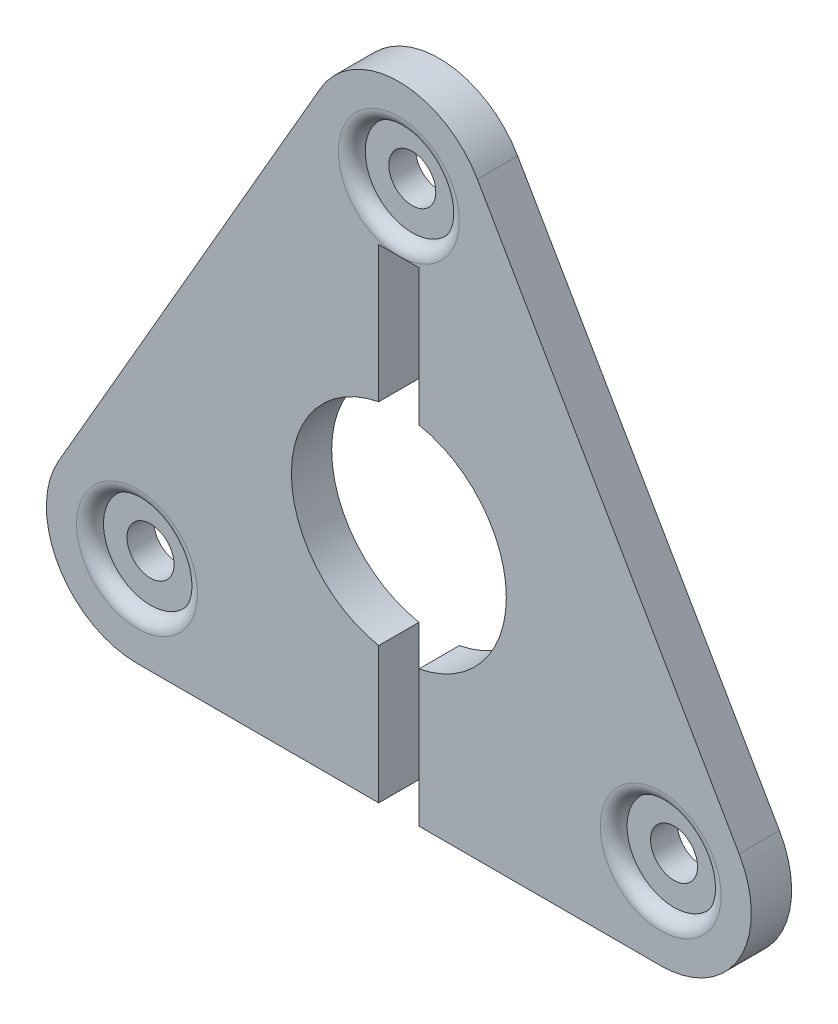
ISO-10303-21;
HEADER;
FILE_DESCRIPTION(('STEP AP214'),'2;1');
FILE_NAME('part.step','',(''),(''),'','','');
FILE_SCHEMA(('AUTOMOTIVE_DESIGN { 1 0 10303 214 1 1 1 1 }'));
ENDSEC;
DATA;
#1=APPLICATION_CONTEXT('core data for automotive mechanical design processes');
#2=APPLICATION_PROTOCOL_DEFINITION('international standard','automotive_design',2000,#1);
#3=PRODUCT_CONTEXT('',#1,'mechanical');
#4=PRODUCT('Part','Part','',(#3));
#5=PRODUCT_RELATED_PRODUCT_CATEGORY('part','',(#4));
#6=PRODUCT_DEFINITION_FORMATION('','',#4);
#7=PRODUCT_DEFINITION_CONTEXT('part definition',#1,'design');
#8=PRODUCT_DEFINITION('design','',#6,#7);
#9=PRODUCT_DEFINITION_SHAPE('','',#8);
#10=(LENGTH_UNIT() NAMED_UNIT(*) SI_UNIT(.MILLI.,.METRE.));
#11=(NAMED_UNIT(*) PLANE_ANGLE_UNIT() SI_UNIT($,.RADIAN.));
#12=(NAMED_UNIT(*) SI_UNIT($,.STERADIAN.) SOLID_ANGLE_UNIT());
#13=UNCERTAINTY_MEASURE_WITH_UNIT(LENGTH_MEASURE(1.E-05),#10,'distance_accuracy_value','');
#14=(GEOMETRIC_REPRESENTATION_CONTEXT(3) GLOBAL_UNCERTAINTY_ASSIGNED_CONTEXT((#13)) GLOBAL_UNIT_ASSIGNED_CONTEXT((#10,
#11,#12)) REPRESENTATION_CONTEXT('',''));
#15=CARTESIAN_POINT('',(0.,0.,0.));
#16=DIRECTION('',(0.,0.,1.));
#17=DIRECTION('',(1.,0.,0.));
#18=AXIS2_PLACEMENT_3D('',#15,#16,#17);
#19=CARTESIAN_POINT('',(19.48557158515,-11.25,3.));
#20=DIRECTION('',(0.,0.,-1.));
#21=DIRECTION('',(-1.,0.,0.));
#22=AXIS2_PLACEMENT_3D('',#19,#20,#21);
#23=CYLINDRICAL_SURFACE('',#22,1.75);
#24=CARTESIAN_POINT('',(19.48557158515,-11.25,0.));
#25=DIRECTION('',(0.,0.,1.));
#26=DIRECTION('',(1.,0.,0.));
#27=AXIS2_PLACEMENT_3D('',#24,#25,#26);
#28=CIRCLE('',#27,1.75);
#29=CARTESIAN_POINT('',(21.23557158515,-11.25,0.));
#30=VERTEX_POINT('',#29);
#31=EDGE_CURVE('E427',#30,#30,#28,.T.);
#32=ORIENTED_EDGE('',*,*,#31,.F.);
#33=EDGE_LOOP('',(#32));
#34=FACE_BOUND('',#33,.T.);
#35=CARTESIAN_POINT('',(19.48557158515,-11.25,2.));
#36=DIRECTION('',(0.,0.,1.));
#37=DIRECTION('',(1.,0.,0.));
#38=AXIS2_PLACEMENT_3D('',#35,#36,#37);
#39=CIRCLE('',#38,1.75);
#40=CARTESIAN_POINT('',(21.23557158515,-11.25,2.));
#41=VERTEX_POINT('',#40);
#42=EDGE_CURVE('E302',#41,#41,#39,.T.);
#43=ORIENTED_EDGE('',*,*,#42,.T.);
#44=EDGE_LOOP('',(#43));
#45=FACE_BOUND('',#44,.T.);
#46=ADVANCED_FACE('F100',(#34,#45),#23,.F.);
#47=CARTESIAN_POINT('',(0.,22.5,3.));
#48=DIRECTION('',(0.,0.,-1.));
#49=DIRECTION('',(-1.,0.,0.));
#50=AXIS2_PLACEMENT_3D('',#47,#48,#49);
#51=CYLINDRICAL_SURFACE('',#50,1.75);
#52=CARTESIAN_POINT('',(0.,22.5,0.));
#53=DIRECTION('',(0.,0.,1.));
#54=DIRECTION('',(1.,0.,0.));
#55=AXIS2_PLACEMENT_3D('',#52,#53,#54);
#56=CIRCLE('',#55,1.75);
#57=CARTESIAN_POINT('',(1.75,22.5,0.));
#58=VERTEX_POINT('',#57);
#59=EDGE_CURVE('E424',#58,#58,#56,.T.);
#60=ORIENTED_EDGE('',*,*,#59,.F.);
#61=EDGE_LOOP('',(#60));
#62=FACE_BOUND('',#61,.T.);
#63=CARTESIAN_POINT('',(0.,22.5,2.));
#64=DIRECTION('',(0.,0.,1.));
#65=DIRECTION('',(1.,0.,0.));
#66=AXIS2_PLACEMENT_3D('',#63,#64,#65);
#67=CIRCLE('',#66,1.75);
#68=CARTESIAN_POINT('',(1.75,22.5,2.));
#69=VERTEX_POINT('',#68);
#70=EDGE_CURVE('E295',#69,#69,#67,.T.);
#71=ORIENTED_EDGE('',*,*,#70,.T.);
#72=EDGE_LOOP('',(#71));
#73=FACE_BOUND('',#72,.T.);
#74=ADVANCED_FACE('F341',(#62,#73),#51,.F.);
#75=CARTESIAN_POINT('',(-19.48557158515,-11.25,3.));
#76=DIRECTION('',(0.,0.,-1.));
#77=DIRECTION('',(-1.,0.,0.));
#78=AXIS2_PLACEMENT_3D('',#75,#76,#77);
#79=CYLINDRICAL_SURFACE('',#78,1.75);
#80=CARTESIAN_POINT('',(-19.48557158515,-11.25,0.));
#81=DIRECTION('',(0.,0.,1.));
#82=DIRECTION('',(1.,0.,0.));
#83=AXIS2_PLACEMENT_3D('',#80,#81,#82);
#84=CIRCLE('',#83,1.75);
#85=CARTESIAN_POINT('',(-17.73557158515,-11.25,0.));
#86=VERTEX_POINT('',#85);
#87=EDGE_CURVE('E277',#86,#86,#84,.T.);
#88=ORIENTED_EDGE('',*,*,#87,.F.);
#89=EDGE_LOOP('',(#88));
#90=FACE_BOUND('',#89,.T.);
#91=CARTESIAN_POINT('',(-19.48557158515,-11.25,2.));
#92=DIRECTION('',(0.,0.,1.));
#93=DIRECTION('',(1.,0.,0.));
#94=AXIS2_PLACEMENT_3D('',#91,#92,#93);
#95=CIRCLE('',#94,1.75);
#96=CARTESIAN_POINT('',(-17.73557158515,-11.25,2.));
#97=VERTEX_POINT('',#96);
#98=EDGE_CURVE('E289',#97,#97,#95,.T.);
#99=ORIENTED_EDGE('',*,*,#98,.T.);
#100=EDGE_LOOP('',(#99));
#101=FACE_BOUND('',#100,.T.);
#102=ADVANCED_FACE('F347',(#90,#101),#79,.F.);
#103=CARTESIAN_POINT('',(0.,0.,3.));
#104=DIRECTION('',(0.,0.,-1.));
#105=DIRECTION('',(-1.,0.,0.));
#106=AXIS2_PLACEMENT_3D('',#103,#104,#105);
#107=CYLINDRICAL_SURFACE('',#106,8.);
#108=CARTESIAN_POINT('',(0.,0.,0.));
#109=DIRECTION('',(0.,0.,1.));
#110=DIRECTION('',(1.,0.,0.));
#111=AXIS2_PLACEMENT_3D('',#108,#109,#110);
#112=CIRCLE('',#111,8.);
#113=CARTESIAN_POINT('',(-1.50000000000001,7.85811682275086,0.));
#114=VERTEX_POINT('',#113);
#115=CARTESIAN_POINT('',(-1.5,-7.85811682275085,0.));
#116=VERTEX_POINT('',#115);
#117=EDGE_CURVE('E310',#114,#116,#112,.T.);
#118=ORIENTED_EDGE('',*,*,#117,.F.);
#119=DIRECTION('',(0.,0.,-1.));
#120=VECTOR('',#119,1.);
#121=CARTESIAN_POINT('',(-1.50000000000001,7.85811682275086,3.));
#122=LINE('',#121,#120);
#123=CARTESIAN_POINT('',(-1.50000000000001,7.85811682275086,3.));
#124=VERTEX_POINT('',#123);
#125=EDGE_CURVE('E178',#124,#114,#122,.T.);
#126=ORIENTED_EDGE('',*,*,#125,.F.);
#127=CARTESIAN_POINT('',(0.,0.,3.));
#128=DIRECTION('',(0.,0.,1.));
#129=DIRECTION('',(1.,0.,0.));
#130=AXIS2_PLACEMENT_3D('',#127,#128,#129);
#131=CIRCLE('',#130,8.);
#132=CARTESIAN_POINT('',(-1.5,-7.85811682275085,3.));
#133=VERTEX_POINT('',#132);
#134=EDGE_CURVE('E264',#124,#133,#131,.T.);
#135=ORIENTED_EDGE('',*,*,#134,.T.);
#136=DIRECTION('',(0.,0.,-1.));
#137=VECTOR('',#136,1.);
#138=CARTESIAN_POINT('',(-1.5,-7.85811682275085,3.));
#139=LINE('',#138,#137);
#140=EDGE_CURVE('E173',#133,#116,#139,.T.);
#141=ORIENTED_EDGE('',*,*,#140,.T.);
#142=EDGE_LOOP('',(#118,#126,#135,#141));
#143=FACE_BOUND('',#142,.T.);
#144=ADVANCED_FACE('F388',(#143),#107,.F.);
#145=CARTESIAN_POINT('',(-1.50000000000001,0.,3.));
#146=DIRECTION('',(1.,0.,0.));
#147=DIRECTION('',(0.,0.,-1.));
#148=AXIS2_PLACEMENT_3D('',#145,#146,#147);
#149=PLANE('',#148);
#150=DIRECTION('',(0.,-1.,0.));
#151=VECTOR('',#150,1.);
#152=CARTESIAN_POINT('',(-1.50000000000001,0.,0.));
#153=LINE('',#152,#151);
#154=CARTESIAN_POINT('',(-1.50000000000001,18.,0.));
#155=VERTEX_POINT('',#154);
#156=EDGE_CURVE('E476',#155,#114,#153,.T.);
#157=ORIENTED_EDGE('',*,*,#156,.F.);
#158=DIRECTION('',(0.,0.,-1.));
#159=VECTOR('',#158,1.);
#160=CARTESIAN_POINT('',(-1.50000000000001,18.,3.));
#161=LINE('',#160,#159);
#162=CARTESIAN_POINT('',(-1.50000000000001,18.,3.));
#163=VERTEX_POINT('',#162);
#164=EDGE_CURVE('E468',#163,#155,#161,.T.);
#165=ORIENTED_EDGE('',*,*,#164,.F.);
#166=DIRECTION('',(0.,-1.,0.));
#167=VECTOR('',#166,1.);
#168=CARTESIAN_POINT('',(-1.50000000000001,0.,3.));
#169=LINE('',#168,#167);
#170=EDGE_CURVE('E272',#163,#124,#169,.T.);
#171=ORIENTED_EDGE('',*,*,#170,.T.);
#172=ORIENTED_EDGE('',*,*,#125,.T.);
#173=EDGE_LOOP('',(#157,#165,#171,#172));
#174=FACE_BOUND('',#173,.T.);
#175=ADVANCED_FACE('F395',(#174),#149,.T.);
#176=CARTESIAN_POINT('',(0.,18.,3.));
#177=DIRECTION('',(0.,1.,0.));
#178=DIRECTION('',(0.,0.,1.));
#179=AXIS2_PLACEMENT_3D('',#176,#177,#178);
#180=PLANE('',#179);
#181=DIRECTION('',(1.,0.,0.));
#182=VECTOR('',#181,1.);
#183=CARTESIAN_POINT('',(0.,18.,0.));
#184=LINE('',#183,#182);
#185=CARTESIAN_POINT('',(1.50000000000001,18.,0.));
#186=VERTEX_POINT('',#185);
#187=EDGE_CURVE('E482',#155,#186,#184,.T.);
#188=ORIENTED_EDGE('',*,*,#187,.T.);
#189=DIRECTION('',(0.,0.,-1.));
#190=VECTOR('',#189,1.);
#191=CARTESIAN_POINT('',(1.50000000000001,18.,3.));
#192=LINE('',#191,#190);
#193=CARTESIAN_POINT('',(1.50000000000001,18.,3.));
#194=VERTEX_POINT('',#193);
#195=EDGE_CURVE('E465',#194,#186,#192,.T.);
#196=ORIENTED_EDGE('',*,*,#195,.F.);
#197=DIRECTION('',(1.,0.,0.));
#198=VECTOR('',#197,1.);
#199=CARTESIAN_POINT('',(0.,18.,3.));
#200=LINE('',#199,#198);
#201=CARTESIAN_POINT('',(0.,18.,3.));
#202=VERTEX_POINT('',#201);
#203=EDGE_CURVE('E271',#202,#194,#200,.T.);
#204=ORIENTED_EDGE('',*,*,#203,.F.);
#205=EDGE_CURVE('E268',#163,#202,#200,.T.);
#206=ORIENTED_EDGE('',*,*,#205,.F.);
#207=ORIENTED_EDGE('',*,*,#164,.T.);
#208=EDGE_LOOP('',(#188,#196,#204,#206,#207));
#209=FACE_BOUND('',#208,.T.);
#210=ADVANCED_FACE('F391',(#209),#180,.F.);
#211=CARTESIAN_POINT('',(1.50000000000001,0.,3.));
#212=DIRECTION('',(1.,0.,0.));
#213=DIRECTION('',(0.,0.,-1.));
#214=AXIS2_PLACEMENT_3D('',#211,#212,#213);
#215=PLANE('',#214);
#216=DIRECTION('',(0.,-1.,0.));
#217=VECTOR('',#216,1.);
#218=CARTESIAN_POINT('',(1.50000000000001,0.,0.));
#219=LINE('',#218,#217);
#220=CARTESIAN_POINT('',(1.5,7.85811682275086,0.));
#221=VERTEX_POINT('',#220);
#222=EDGE_CURVE('E487',#186,#221,#219,.T.);
#223=ORIENTED_EDGE('',*,*,#222,.T.);
#224=DIRECTION('',(0.,0.,-1.));
#225=VECTOR('',#224,1.);
#226=CARTESIAN_POINT('',(1.5,7.85811682275086,3.));
#227=LINE('',#226,#225);
#228=CARTESIAN_POINT('',(1.5,7.85811682275086,3.));
#229=VERTEX_POINT('',#228);
#230=EDGE_CURVE('E462',#229,#221,#227,.T.);
#231=ORIENTED_EDGE('',*,*,#230,.F.);
#232=DIRECTION('',(0.,-1.,0.));
#233=VECTOR('',#232,1.);
#234=CARTESIAN_POINT('',(1.50000000000001,0.,3.));
#235=LINE('',#234,#233);
#236=EDGE_CURVE('E262',#194,#229,#235,.T.);
#237=ORIENTED_EDGE('',*,*,#236,.F.);
#238=ORIENTED_EDGE('',*,*,#195,.T.);
#239=EDGE_LOOP('',(#223,#231,#237,#238));
#240=FACE_BOUND('',#239,.T.);
#241=ADVANCED_FACE('F386',(#240),#215,.F.);
#242=CARTESIAN_POINT('',(1.50000000000001,-7.85811682275086,0.));
#243=VERTEX_POINT('',#242);
#244=EDGE_CURVE('E480',#243,#221,#112,.T.);
#245=ORIENTED_EDGE('',*,*,#244,.F.);
#246=DIRECTION('',(0.,0.,-1.));
#247=VECTOR('',#246,1.);
#248=CARTESIAN_POINT('',(1.50000000000001,-7.85811682275086,3.));
#249=LINE('',#248,#247);
#250=CARTESIAN_POINT('',(1.50000000000001,-7.85811682275086,3.));
#251=VERTEX_POINT('',#250);
#252=EDGE_CURVE('E459',#251,#243,#249,.T.);
#253=ORIENTED_EDGE('',*,*,#252,.F.);
#254=EDGE_CURVE('E256',#251,#229,#131,.T.);
#255=ORIENTED_EDGE('',*,*,#254,.T.);
#256=ORIENTED_EDGE('',*,*,#230,.T.);
#257=EDGE_LOOP('',(#245,#253,#255,#256));
#258=FACE_BOUND('',#257,.T.);
#259=ADVANCED_FACE('F383',(#258),#107,.F.);
#260=CARTESIAN_POINT('',(1.50000000000001,0.,3.));
#261=DIRECTION('',(-1.,0.,0.));
#262=DIRECTION('',(0.,-1.,0.));
#263=AXIS2_PLACEMENT_3D('',#260,#261,#262);
#264=PLANE('',#263);
#265=DIRECTION('',(0.,1.,0.));
#266=VECTOR('',#265,1.);
#267=CARTESIAN_POINT('',(1.50000000000001,0.,0.));
#268=LINE('',#267,#266);
#269=CARTESIAN_POINT('',(1.5,-18.,0.));
#270=VERTEX_POINT('',#269);
#271=EDGE_CURVE('E493',#270,#243,#268,.T.);
#272=ORIENTED_EDGE('',*,*,#271,.F.);
#273=DIRECTION('',(0.,0.,-1.));
#274=VECTOR('',#273,1.);
#275=CARTESIAN_POINT('',(1.5,-18.,3.));
#276=LINE('',#275,#274);
#277=CARTESIAN_POINT('',(1.5,-18.,3.));
#278=VERTEX_POINT('',#277);
#279=EDGE_CURVE('E456',#278,#270,#276,.T.);
#280=ORIENTED_EDGE('',*,*,#279,.F.);
#281=DIRECTION('',(0.,1.,0.));
#282=VECTOR('',#281,1.);
#283=CARTESIAN_POINT('',(1.50000000000001,0.,3.));
#284=LINE('',#283,#282);
#285=EDGE_CURVE('E247',#278,#251,#284,.T.);
#286=ORIENTED_EDGE('',*,*,#285,.T.);
#287=ORIENTED_EDGE('',*,*,#252,.T.);
#288=EDGE_LOOP('',(#272,#280,#286,#287));
#289=FACE_BOUND('',#288,.T.);
#290=ADVANCED_FACE('F380',(#289),#264,.T.);
#291=CARTESIAN_POINT('',(0.,-18.,3.));
#292=DIRECTION('',(0.,-1.,0.));
#293=DIRECTION('',(1.,0.,0.));
#294=AXIS2_PLACEMENT_3D('',#291,#292,#293);
#295=PLANE('',#294);
#296=DIRECTION('',(-1.,0.,0.));
#297=VECTOR('',#296,1.);
#298=CARTESIAN_POINT('',(0.,-18.,0.));
#299=LINE('',#298,#297);
#300=CARTESIAN_POINT('',(19.48557158515,-18.,0.));
#301=VERTEX_POINT('',#300);
#302=EDGE_CURVE('E497',#301,#270,#299,.T.);
#303=ORIENTED_EDGE('',*,*,#302,.F.);
#304=DIRECTION('',(0.,0.,-1.));
#305=VECTOR('',#304,1.);
#306=CARTESIAN_POINT('',(19.48557158515,-18.,3.));
#307=LINE('',#306,#305);
#308=CARTESIAN_POINT('',(19.48557158515,-18.,3.));
#309=VERTEX_POINT('',#308);
#310=EDGE_CURVE('E453',#309,#301,#307,.T.);
#311=ORIENTED_EDGE('',*,*,#310,.F.);
#312=DIRECTION('',(-1.,0.,0.));
#313=VECTOR('',#312,1.);
#314=CARTESIAN_POINT('',(0.,-18.,3.));
#315=LINE('',#314,#313);
#316=EDGE_CURVE('E238',#309,#278,#315,.T.);
#317=ORIENTED_EDGE('',*,*,#316,.T.);
#318=ORIENTED_EDGE('',*,*,#279,.T.);
#319=EDGE_LOOP('',(#303,#311,#317,#318));
#320=FACE_BOUND('',#319,.T.);
#321=ADVANCED_FACE('F361',(#320),#295,.T.);
#322=CARTESIAN_POINT('',(19.48557158515,-11.25,3.));
#323=DIRECTION('',(0.,0.,-1.));
#324=DIRECTION('',(-1.,0.,0.));
#325=AXIS2_PLACEMENT_3D('',#322,#323,#324);
#326=CYLINDRICAL_SURFACE('',#325,6.75);
#327=CARTESIAN_POINT('',(19.48557158515,-11.25,0.));
#328=DIRECTION('',(0.,0.,1.));
#329=DIRECTION('',(1.,0.,0.));
#330=AXIS2_PLACEMENT_3D('',#327,#328,#329);
#331=CIRCLE('',#330,6.75);
#332=CARTESIAN_POINT('',(25.3312430606949,-7.87499999999995,0.));
#333=VERTEX_POINT('',#332);
#334=EDGE_CURVE('E501',#333,#301,#331,.F.);
#335=ORIENTED_EDGE('',*,*,#334,.F.);
#336=DIRECTION('',(0.,0.,-1.));
#337=VECTOR('',#336,1.);
#338=CARTESIAN_POINT('',(25.3312430606949,-7.87499999999995,3.));
#339=LINE('',#338,#337);
#340=CARTESIAN_POINT('',(25.3312430606949,-7.87499999999995,3.));
#341=VERTEX_POINT('',#340);
#342=EDGE_CURVE('E450',#341,#333,#339,.T.);
#343=ORIENTED_EDGE('',*,*,#342,.F.);
#344=CARTESIAN_POINT('',(19.48557158515,-11.25,3.));
#345=DIRECTION('',(0.,0.,1.));
#346=DIRECTION('',(1.,0.,0.));
#347=AXIS2_PLACEMENT_3D('',#344,#345,#346);
#348=CIRCLE('',#347,6.75);
#349=EDGE_CURVE('E246',#341,#309,#348,.F.);
#350=ORIENTED_EDGE('',*,*,#349,.T.);
#351=ORIENTED_EDGE('',*,*,#310,.T.);
#352=EDGE_LOOP('',(#335,#343,#350,#351));
#353=FACE_BOUND('',#352,.T.);
#354=ADVANCED_FACE('F375',(#353),#326,.T.);
#355=CARTESIAN_POINT('',(15.58845726812,9.00000000000004,3.));
#356=DIRECTION('',(0.86602540378444,0.500000000000002,0.));
#357=DIRECTION('',(-0.500000000000003,0.866025403784439,0.));
#358=AXIS2_PLACEMENT_3D('',#355,#356,#357);
#359=PLANE('',#358);
#360=DIRECTION('',(0.500000000000003,-0.866025403784438,0.));
#361=VECTOR('',#360,1.);
#362=CARTESIAN_POINT('',(15.58845726812,9.00000000000004,0.));
#363=LINE('',#362,#361);
#364=CARTESIAN_POINT('',(5.84567147554496,25.875,0.));
#365=VERTEX_POINT('',#364);
#366=EDGE_CURVE('E506',#365,#333,#363,.T.);
#367=ORIENTED_EDGE('',*,*,#366,.F.);
#368=DIRECTION('',(0.,0.,-1.));
#369=VECTOR('',#368,1.);
#370=CARTESIAN_POINT('',(5.84567147554496,25.875,3.));
#371=LINE('',#370,#369);
#372=CARTESIAN_POINT('',(5.84567147554496,25.875,3.));
#373=VERTEX_POINT('',#372);
#374=EDGE_CURVE('E447',#373,#365,#371,.T.);
#375=ORIENTED_EDGE('',*,*,#374,.F.);
#376=DIRECTION('',(0.500000000000003,-0.866025403784438,0.));
#377=VECTOR('',#376,1.);
#378=CARTESIAN_POINT('',(15.58845726812,9.00000000000004,3.));
#379=LINE('',#378,#377);
#380=EDGE_CURVE('E254',#373,#341,#379,.T.);
#381=ORIENTED_EDGE('',*,*,#380,.T.);
#382=ORIENTED_EDGE('',*,*,#342,.T.);
#383=EDGE_LOOP('',(#367,#375,#381,#382));
#384=FACE_BOUND('',#383,.T.);
#385=ADVANCED_FACE('F371',(#384),#359,.T.);
#386=CARTESIAN_POINT('',(0.,22.5,3.));
#387=DIRECTION('',(0.,0.,-1.));
#388=DIRECTION('',(-1.,0.,0.));
#389=AXIS2_PLACEMENT_3D('',#386,#387,#388);
#390=CYLINDRICAL_SURFACE('',#389,6.75);
#391=CARTESIAN_POINT('',(0.,22.5,0.));
#392=DIRECTION('',(0.,0.,1.));
#393=DIRECTION('',(1.,0.,0.));
#394=AXIS2_PLACEMENT_3D('',#391,#392,#393);
#395=CIRCLE('',#394,6.75);
#396=CARTESIAN_POINT('',(-5.84567147554498,25.875,0.));
#397=VERTEX_POINT('',#396);
#398=EDGE_CURVE('E510',#397,#365,#395,.F.);
#399=ORIENTED_EDGE('',*,*,#398,.F.);
#400=DIRECTION('',(0.,0.,-1.));
#401=VECTOR('',#400,1.);
#402=CARTESIAN_POINT('',(-5.84567147554498,25.875,3.));
#403=LINE('',#402,#401);
#404=CARTESIAN_POINT('',(-5.84567147554498,25.875,3.));
#405=VERTEX_POINT('',#404);
#406=EDGE_CURVE('E444',#405,#397,#403,.T.);
#407=ORIENTED_EDGE('',*,*,#406,.F.);
#408=CARTESIAN_POINT('',(0.,22.5,3.));
#409=DIRECTION('',(0.,0.,1.));
#410=DIRECTION('',(1.,0.,0.));
#411=AXIS2_PLACEMENT_3D('',#408,#409,#410);
#412=CIRCLE('',#411,6.75);
#413=EDGE_CURVE('E597',#405,#373,#412,.F.);
#414=ORIENTED_EDGE('',*,*,#413,.T.);
#415=ORIENTED_EDGE('',*,*,#374,.T.);
#416=EDGE_LOOP('',(#399,#407,#414,#415));
#417=FACE_BOUND('',#416,.T.);
#418=ADVANCED_FACE('F367',(#417),#390,.T.);
#419=CARTESIAN_POINT('',(-15.58845726812,9.00000000000004,3.));
#420=DIRECTION('',(-0.866025403784441,0.500000000000001,0.));
#421=DIRECTION('',(-0.500000000000003,-0.866025403784439,0.));
#422=AXIS2_PLACEMENT_3D('',#419,#420,#421);
#423=PLANE('',#422);
#424=DIRECTION('',(0.500000000000003,0.866025403784439,0.));
#425=VECTOR('',#424,1.);
#426=CARTESIAN_POINT('',(-15.58845726812,9.00000000000004,0.));
#427=LINE('',#426,#425);
#428=CARTESIAN_POINT('',(-25.3312430606949,-7.87499999999996,0.));
#429=VERTEX_POINT('',#428);
#430=EDGE_CURVE('E514',#429,#397,#427,.T.);
#431=ORIENTED_EDGE('',*,*,#430,.F.);
#432=DIRECTION('',(0.,0.,-1.));
#433=VECTOR('',#432,1.);
#434=CARTESIAN_POINT('',(-25.3312430606949,-7.87499999999996,3.));
#435=LINE('',#434,#433);
#436=CARTESIAN_POINT('',(-25.3312430606949,-7.87499999999996,3.));
#437=VERTEX_POINT('',#436);
#438=EDGE_CURVE('E232',#437,#429,#435,.T.);
#439=ORIENTED_EDGE('',*,*,#438,.F.);
#440=DIRECTION('',(0.500000000000003,0.866025403784439,0.));
#441=VECTOR('',#440,1.);
#442=CARTESIAN_POINT('',(-15.58845726812,9.00000000000004,3.));
#443=LINE('',#442,#441);
#444=EDGE_CURVE('E219',#437,#405,#443,.T.);
#445=ORIENTED_EDGE('',*,*,#444,.T.);
#446=ORIENTED_EDGE('',*,*,#406,.T.);
#447=EDGE_LOOP('',(#431,#439,#445,#446));
#448=FACE_BOUND('',#447,.T.);
#449=ADVANCED_FACE('F364',(#448),#423,.T.);
#450=CARTESIAN_POINT('',(-19.48557158515,-11.25,3.));
#451=DIRECTION('',(0.,0.,-1.));
#452=DIRECTION('',(-1.,0.,0.));
#453=AXIS2_PLACEMENT_3D('',#450,#451,#452);
#454=CYLINDRICAL_SURFACE('',#453,6.75);
#455=CARTESIAN_POINT('',(-19.48557158515,-11.25,0.));
#456=DIRECTION('',(0.,0.,1.));
#457=DIRECTION('',(1.,0.,0.));
#458=AXIS2_PLACEMENT_3D('',#455,#456,#457);
#459=CIRCLE('',#458,6.75);
#460=CARTESIAN_POINT('',(-19.48557158515,-18.,0.));
#461=VERTEX_POINT('',#460);
#462=EDGE_CURVE('E227',#429,#461,#459,.T.);
#463=ORIENTED_EDGE('',*,*,#462,.T.);
#464=DIRECTION('',(0.,0.,-1.));
#465=VECTOR('',#464,1.);
#466=CARTESIAN_POINT('',(-19.48557158515,-18.,3.));
#467=LINE('',#466,#465);
#468=CARTESIAN_POINT('',(-19.48557158515,-18.,3.));
#469=VERTEX_POINT('',#468);
#470=EDGE_CURVE('E224',#469,#461,#467,.T.);
#471=ORIENTED_EDGE('',*,*,#470,.F.);
#472=CARTESIAN_POINT('',(-19.48557158515,-11.25,3.));
#473=DIRECTION('',(0.,0.,1.));
#474=DIRECTION('',(1.,0.,0.));
#475=AXIS2_PLACEMENT_3D('',#472,#473,#474);
#476=CIRCLE('',#475,6.75);
#477=EDGE_CURVE('E211',#437,#469,#476,.T.);
#478=ORIENTED_EDGE('',*,*,#477,.F.);
#479=ORIENTED_EDGE('',*,*,#438,.T.);
#480=EDGE_LOOP('',(#463,#471,#478,#479));
#481=FACE_BOUND('',#480,.T.);
#482=ADVANCED_FACE('F225',(#481),#454,.T.);
#483=CARTESIAN_POINT('',(-1.50000000000002,-18.,0.));
#484=VERTEX_POINT('',#483);
#485=EDGE_CURVE('E502',#484,#461,#299,.T.);
#486=ORIENTED_EDGE('',*,*,#485,.F.);
#487=DIRECTION('',(0.,0.,-1.));
#488=VECTOR('',#487,1.);
#489=CARTESIAN_POINT('',(-1.50000000000002,-18.,3.));
#490=LINE('',#489,#488);
#491=CARTESIAN_POINT('',(-1.50000000000002,-18.,3.));
#492=VERTEX_POINT('',#491);
#493=EDGE_CURVE('E233',#492,#484,#490,.T.);
#494=ORIENTED_EDGE('',*,*,#493,.F.);
#495=EDGE_CURVE('E216',#492,#469,#315,.T.);
#496=ORIENTED_EDGE('',*,*,#495,.T.);
#497=ORIENTED_EDGE('',*,*,#470,.T.);
#498=EDGE_LOOP('',(#486,#494,#496,#497));
#499=FACE_BOUND('',#498,.T.);
#500=ADVANCED_FACE('F235',(#499),#295,.T.);
#501=CARTESIAN_POINT('',(-1.50000000000001,0.,3.));
#502=DIRECTION('',(-1.,0.,0.));
#503=DIRECTION('',(0.,-1.,0.));
#504=AXIS2_PLACEMENT_3D('',#501,#502,#503);
#505=PLANE('',#504);
#506=DIRECTION('',(0.,1.,0.));
#507=VECTOR('',#506,1.);
#508=CARTESIAN_POINT('',(-1.50000000000001,0.,0.));
#509=LINE('',#508,#507);
#510=EDGE_CURVE('E520',#484,#116,#509,.T.);
#511=ORIENTED_EDGE('',*,*,#510,.T.);
#512=ORIENTED_EDGE('',*,*,#140,.F.);
#513=DIRECTION('',(0.,1.,0.));
#514=VECTOR('',#513,1.);
#515=CARTESIAN_POINT('',(-1.50000000000001,0.,3.));
#516=LINE('',#515,#514);
#517=EDGE_CURVE('E122',#492,#133,#516,.T.);
#518=ORIENTED_EDGE('',*,*,#517,.F.);
#519=ORIENTED_EDGE('',*,*,#493,.T.);
#520=EDGE_LOOP('',(#511,#512,#518,#519));
#521=FACE_BOUND('',#520,.T.);
#522=ADVANCED_FACE('F355',(#521),#505,.F.);
#523=CARTESIAN_POINT('',(0.,0.,3.));
#524=DIRECTION('',(0.,0.,1.));
#525=DIRECTION('',(1.,0.,0.));
#526=AXIS2_PLACEMENT_3D('',#523,#524,#525);
#527=PLANE('',#526);
#528=CARTESIAN_POINT('',(-19.48557158515,-11.25,3.));
#529=DIRECTION('',(0.,0.,1.));
#530=DIRECTION('',(1.,0.,0.));
#531=AXIS2_PLACEMENT_3D('',#528,#529,#530);
#532=CIRCLE('',#531,4.5);
#533=CARTESIAN_POINT('',(-14.9855715851499,-11.25,3.));
#534=VERTEX_POINT('',#533);
#535=EDGE_CURVE('E14',#534,#534,#532,.F.);
#536=ORIENTED_EDGE('',*,*,#535,.T.);
#537=EDGE_LOOP('',(#536));
#538=FACE_BOUND('',#537,.T.);
#539=CARTESIAN_POINT('',(19.48557158515,-11.25,3.));
#540=DIRECTION('',(0.,0.,1.));
#541=DIRECTION('',(1.,0.,0.));
#542=AXIS2_PLACEMENT_3D('',#539,#540,#541);
#543=CIRCLE('',#542,4.5);
#544=CARTESIAN_POINT('',(23.98557158515,-11.25,3.));
#545=VERTEX_POINT('',#544);
#546=EDGE_CURVE('E109',#545,#545,#543,.F.);
#547=ORIENTED_EDGE('',*,*,#546,.T.);
#548=EDGE_LOOP('',(#547));
#549=FACE_BOUND('',#548,.T.);
#550=ORIENTED_EDGE('',*,*,#205,.T.);
#551=CARTESIAN_POINT('',(0.,22.5,3.));
#552=DIRECTION('',(0.,0.,1.));
#553=DIRECTION('',(1.,0.,0.));
#554=AXIS2_PLACEMENT_3D('',#551,#552,#553);
#555=CIRCLE('',#554,4.5);
#556=EDGE_CURVE('E114',#202,#202,#555,.F.);
#557=ORIENTED_EDGE('',*,*,#556,.T.);
#558=ORIENTED_EDGE('',*,*,#203,.T.);
#559=ORIENTED_EDGE('',*,*,#236,.T.);
#560=ORIENTED_EDGE('',*,*,#254,.F.);
#561=ORIENTED_EDGE('',*,*,#285,.F.);
#562=ORIENTED_EDGE('',*,*,#316,.F.);
#563=ORIENTED_EDGE('',*,*,#349,.F.);
#564=ORIENTED_EDGE('',*,*,#380,.F.);
#565=ORIENTED_EDGE('',*,*,#413,.F.);
#566=ORIENTED_EDGE('',*,*,#444,.F.);
#567=ORIENTED_EDGE('',*,*,#477,.T.);
#568=ORIENTED_EDGE('',*,*,#495,.F.);
#569=ORIENTED_EDGE('',*,*,#517,.T.);
#570=ORIENTED_EDGE('',*,*,#134,.F.);
#571=ORIENTED_EDGE('',*,*,#170,.F.);
#572=EDGE_LOOP('',(#550,#557,#558,#559,#560,#561,#562,#563,#564,#565,#566,#567,#568,#569,#570,#571));
#573=FACE_BOUND('',#572,.T.);
#574=ADVANCED_FACE('F214',(#538,#549,#573),#527,.T.);
#575=CARTESIAN_POINT('',(0.,0.,0.));
#576=DIRECTION('',(0.,0.,1.));
#577=DIRECTION('',(1.,0.,0.));
#578=AXIS2_PLACEMENT_3D('',#575,#576,#577);
#579=PLANE('',#578);
#580=ORIENTED_EDGE('',*,*,#117,.T.);
#581=ORIENTED_EDGE('',*,*,#510,.F.);
#582=ORIENTED_EDGE('',*,*,#485,.T.);
#583=ORIENTED_EDGE('',*,*,#462,.F.);
#584=ORIENTED_EDGE('',*,*,#430,.T.);
#585=ORIENTED_EDGE('',*,*,#398,.T.);
#586=ORIENTED_EDGE('',*,*,#366,.T.);
#587=ORIENTED_EDGE('',*,*,#334,.T.);
#588=ORIENTED_EDGE('',*,*,#302,.T.);
#589=ORIENTED_EDGE('',*,*,#271,.T.);
#590=ORIENTED_EDGE('',*,*,#244,.T.);
#591=ORIENTED_EDGE('',*,*,#222,.F.);
#592=ORIENTED_EDGE('',*,*,#187,.F.);
#593=ORIENTED_EDGE('',*,*,#156,.T.);
#594=EDGE_LOOP('',(#580,#581,#582,#583,#584,#585,#586,#587,#588,#589,#590,#591,#592,#593));
#595=FACE_BOUND('',#594,.T.);
#596=ORIENTED_EDGE('',*,*,#59,.T.);
#597=EDGE_LOOP('',(#596));
#598=FACE_BOUND('',#597,.T.);
#599=ORIENTED_EDGE('',*,*,#31,.T.);
#600=EDGE_LOOP('',(#599));
#601=FACE_BOUND('',#600,.T.);
#602=ORIENTED_EDGE('',*,*,#87,.T.);
#603=EDGE_LOOP('',(#602));
#604=FACE_BOUND('',#603,.T.);
#605=ADVANCED_FACE('F336',(#595,#598,#601,#604),#579,.F.);
#606=CARTESIAN_POINT('',(-19.48557158515,-11.25,2.));
#607=DIRECTION('',(0.,0.,1.));
#608=DIRECTION('',(1.,0.,0.));
#609=AXIS2_PLACEMENT_3D('',#606,#607,#608);
#610=PLANE('',#609);
#611=ORIENTED_EDGE('',*,*,#98,.F.);
#612=EDGE_LOOP('',(#611));
#613=FACE_BOUND('',#612,.T.);
#614=CARTESIAN_POINT('',(-19.48557158515,-11.25,2.));
#615=DIRECTION('',(0.,0.,1.));
#616=DIRECTION('',(1.,0.,0.));
#617=AXIS2_PLACEMENT_3D('',#614,#615,#616);
#618=CIRCLE('',#617,3.5);
#619=CARTESIAN_POINT('',(-15.9855715851499,-11.25,2.));
#620=VERTEX_POINT('',#619);
#621=EDGE_CURVE('E278',#620,#620,#618,.T.);
#622=ORIENTED_EDGE('',*,*,#621,.T.);
#623=EDGE_LOOP('',(#622));
#624=FACE_BOUND('',#623,.T.);
#625=ADVANCED_FACE('F327',(#613,#624),#610,.T.);
#626=CARTESIAN_POINT('',(19.48557158515,-11.25,2.));
#627=DIRECTION('',(0.,0.,1.));
#628=DIRECTION('',(1.,0.,0.));
#629=AXIS2_PLACEMENT_3D('',#626,#627,#628);
#630=PLANE('',#629);
#631=ORIENTED_EDGE('',*,*,#42,.F.);
#632=EDGE_LOOP('',(#631));
#633=FACE_BOUND('',#632,.T.);
#634=CARTESIAN_POINT('',(19.48557158515,-11.25,2.));
#635=DIRECTION('',(0.,0.,1.));
#636=DIRECTION('',(1.,0.,0.));
#637=AXIS2_PLACEMENT_3D('',#634,#635,#636);
#638=CIRCLE('',#637,3.5);
#639=CARTESIAN_POINT('',(22.98557158515,-11.25,2.));
#640=VERTEX_POINT('',#639);
#641=EDGE_CURVE('E282',#640,#640,#638,.T.);
#642=ORIENTED_EDGE('',*,*,#641,.T.);
#643=EDGE_LOOP('',(#642));
#644=FACE_BOUND('',#643,.T.);
#645=ADVANCED_FACE('F324',(#633,#644),#630,.T.);
#646=CARTESIAN_POINT('',(0.,22.5,2.));
#647=DIRECTION('',(0.,0.,1.));
#648=DIRECTION('',(1.,0.,0.));
#649=AXIS2_PLACEMENT_3D('',#646,#647,#648);
#650=PLANE('',#649);
#651=ORIENTED_EDGE('',*,*,#70,.F.);
#652=EDGE_LOOP('',(#651));
#653=FACE_BOUND('',#652,.T.);
#654=CARTESIAN_POINT('',(0.,22.5,2.));
#655=DIRECTION('',(0.,0.,1.));
#656=DIRECTION('',(1.,0.,0.));
#657=AXIS2_PLACEMENT_3D('',#654,#655,#656);
#658=CIRCLE('',#657,3.5);
#659=CARTESIAN_POINT('',(3.50000000000001,22.5,2.));
#660=VERTEX_POINT('',#659);
#661=EDGE_CURVE('E286',#660,#660,#658,.T.);
#662=ORIENTED_EDGE('',*,*,#661,.T.);
#663=EDGE_LOOP('',(#662));
#664=FACE_BOUND('',#663,.T.);
#665=ADVANCED_FACE('F326',(#653,#664),#650,.T.);
#666=CARTESIAN_POINT('',(-19.48557158515,-11.25,2.));
#667=DIRECTION('',(0.,0.,1.));
#668=DIRECTION('',(1.,0.,0.));
#669=AXIS2_PLACEMENT_3D('',#666,#667,#668);
#670=TOROIDAL_SURFACE('',#669,4.5,1.);
#671=ORIENTED_EDGE('',*,*,#535,.F.);
#672=EDGE_LOOP('',(#671));
#673=FACE_BOUND('',#672,.T.);
#674=ORIENTED_EDGE('',*,*,#621,.F.);
#675=EDGE_LOOP('',(#674));
#676=FACE_BOUND('',#675,.T.);
#677=ADVANCED_FACE('F321',(#673,#676),#670,.T.);
#678=CARTESIAN_POINT('',(19.48557158515,-11.25,2.));
#679=DIRECTION('',(0.,0.,1.));
#680=DIRECTION('',(1.,0.,0.));
#681=AXIS2_PLACEMENT_3D('',#678,#679,#680);
#682=TOROIDAL_SURFACE('',#681,4.5,1.);
#683=ORIENTED_EDGE('',*,*,#546,.F.);
#684=EDGE_LOOP('',(#683));
#685=FACE_BOUND('',#684,.T.);
#686=ORIENTED_EDGE('',*,*,#641,.F.);
#687=EDGE_LOOP('',(#686));
#688=FACE_BOUND('',#687,.T.);
#689=ADVANCED_FACE('F318',(#685,#688),#682,.T.);
#690=CARTESIAN_POINT('',(0.,22.5,2.));
#691=DIRECTION('',(0.,0.,1.));
#692=DIRECTION('',(1.,0.,0.));
#693=AXIS2_PLACEMENT_3D('',#690,#691,#692);
#694=TOROIDAL_SURFACE('',#693,4.5,1.);
#695=ORIENTED_EDGE('',*,*,#556,.F.);
#696=EDGE_LOOP('',(#695));
#697=FACE_BOUND('',#696,.T.);
#698=ORIENTED_EDGE('',*,*,#661,.F.);
#699=EDGE_LOOP('',(#698));
#700=FACE_BOUND('',#699,.T.);
#701=ADVANCED_FACE('F102',(#697,#700),#694,.T.);
#702=CLOSED_SHELL('',(#46,#74,#102,#144,#175,#210,#241,#259,#290,#321,#354,#385,#418,#449,#482,
#500,#522,#574,#605,#625,#645,#665,#677,#689,#701));
#703=MANIFOLD_SOLID_BREP('B2',#702);
#704=ADVANCED_BREP_SHAPE_REPRESENTATION('',(#18,#703),#14);
#705=SHAPE_DEFINITION_REPRESENTATION(#9,#704);
ENDSEC;
END-ISO-10303-21;
